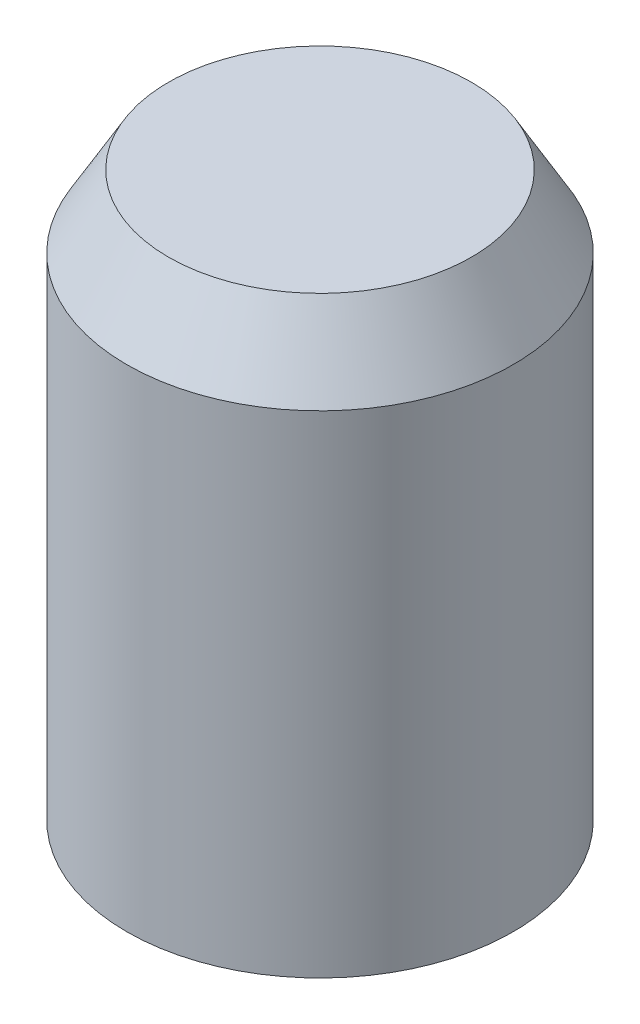
ISO-10303-21;
HEADER;
FILE_DESCRIPTION(('STEP AP214'),'2;1');
FILE_NAME('part.step','',(''),(''),'','','');
FILE_SCHEMA(('AUTOMOTIVE_DESIGN { 1 0 10303 214 1 1 1 1 }'));
ENDSEC;
DATA;
#1=APPLICATION_CONTEXT('core data for automotive mechanical design processes');
#2=APPLICATION_PROTOCOL_DEFINITION('international standard','automotive_design',2000,#1);
#3=PRODUCT_CONTEXT('',#1,'mechanical');
#4=PRODUCT('Part','Part','',(#3));
#5=PRODUCT_RELATED_PRODUCT_CATEGORY('part','',(#4));
#6=PRODUCT_DEFINITION_FORMATION('','',#4);
#7=PRODUCT_DEFINITION_CONTEXT('part definition',#1,'design');
#8=PRODUCT_DEFINITION('design','',#6,#7);
#9=PRODUCT_DEFINITION_SHAPE('','',#8);
#10=(LENGTH_UNIT() NAMED_UNIT(*) SI_UNIT(.MILLI.,.METRE.));
#11=(NAMED_UNIT(*) PLANE_ANGLE_UNIT() SI_UNIT($,.RADIAN.));
#12=(NAMED_UNIT(*) SI_UNIT($,.STERADIAN.) SOLID_ANGLE_UNIT());
#13=UNCERTAINTY_MEASURE_WITH_UNIT(LENGTH_MEASURE(1.E-05),#10,'distance_accuracy_value','');
#14=(GEOMETRIC_REPRESENTATION_CONTEXT(3) GLOBAL_UNCERTAINTY_ASSIGNED_CONTEXT((#13)) GLOBAL_UNIT_ASSIGNED_CONTEXT((#10,
#11,#12)) REPRESENTATION_CONTEXT('',''));
#15=CARTESIAN_POINT('',(0.,0.,0.));
#16=DIRECTION('',(0.,0.,1.));
#17=DIRECTION('',(1.,0.,0.));
#18=AXIS2_PLACEMENT_3D('',#15,#16,#17);
#19=CARTESIAN_POINT('',(0.,39.,0.));
#20=DIRECTION('',(0.,-1.,0.));
#21=DIRECTION('',(0.,0.,-1.));
#22=AXIS2_PLACEMENT_3D('',#19,#20,#21);
#23=CYLINDRICAL_SURFACE('',#22,13.375);
#24=CARTESIAN_POINT('',(0.,34.,0.));
#25=DIRECTION('',(0.,1.,0.));
#26=DIRECTION('',(0.,0.,1.));
#27=AXIS2_PLACEMENT_3D('',#24,#25,#26);
#28=CIRCLE('',#27,13.375);
#29=CARTESIAN_POINT('',(0.,34.,13.375));
#30=VERTEX_POINT('',#29);
#31=EDGE_CURVE('E10',#30,#30,#28,.F.);
#32=ORIENTED_EDGE('',*,*,#31,.T.);
#33=EDGE_LOOP('',(#32));
#34=FACE_BOUND('',#33,.T.);
#35=CARTESIAN_POINT('',(0.,0.,0.));
#36=DIRECTION('',(0.,1.,0.));
#37=DIRECTION('',(0.,0.,1.));
#38=AXIS2_PLACEMENT_3D('',#35,#36,#37);
#39=CIRCLE('',#38,13.375);
#40=CARTESIAN_POINT('',(0.,0.,13.375));
#41=VERTEX_POINT('',#40);
#42=EDGE_CURVE('E57',#41,#41,#39,.T.);
#43=ORIENTED_EDGE('',*,*,#42,.T.);
#44=EDGE_LOOP('',(#43));
#45=FACE_BOUND('',#44,.T.);
#46=ADVANCED_FACE('F43',(#34,#45),#23,.T.);
#47=CARTESIAN_POINT('',(0.,39.,0.));
#48=DIRECTION('',(0.,1.,0.));
#49=DIRECTION('',(0.,0.,1.));
#50=AXIS2_PLACEMENT_3D('',#47,#48,#49);
#51=PLANE('',#50);
#52=CARTESIAN_POINT('',(0.,39.,0.));
#53=DIRECTION('',(0.,1.,0.));
#54=DIRECTION('',(0.,0.,1.));
#55=AXIS2_PLACEMENT_3D('',#52,#53,#54);
#56=CIRCLE('',#55,10.4882486540519);
#57=CARTESIAN_POINT('',(0.,39.,10.4882486540519));
#58=VERTEX_POINT('',#57);
#59=EDGE_CURVE('E52',#58,#58,#56,.T.);
#60=ORIENTED_EDGE('',*,*,#59,.T.);
#61=EDGE_LOOP('',(#60));
#62=FACE_BOUND('',#61,.T.);
#63=ADVANCED_FACE('F68',(#62),#51,.T.);
#64=CARTESIAN_POINT('',(0.,0.,0.));
#65=DIRECTION('',(0.,1.,0.));
#66=DIRECTION('',(0.,0.,1.));
#67=AXIS2_PLACEMENT_3D('',#64,#65,#66);
#68=PLANE('',#67);
#69=ORIENTED_EDGE('',*,*,#42,.F.);
#70=EDGE_LOOP('',(#69));
#71=FACE_BOUND('',#70,.T.);
#72=ADVANCED_FACE('F66',(#71),#68,.F.);
#73=CARTESIAN_POINT('',(0.,39.,0.));
#74=DIRECTION('',(0.,-1.,0.));
#75=DIRECTION('',(0.,0.,-1.));
#76=AXIS2_PLACEMENT_3D('',#73,#74,#75);
#77=CONICAL_SURFACE('',#76,10.4882486540519,0.523598775598297);
#78=ORIENTED_EDGE('',*,*,#31,.F.);
#79=EDGE_LOOP('',(#78));
#80=FACE_BOUND('',#79,.T.);
#81=ORIENTED_EDGE('',*,*,#59,.F.);
#82=EDGE_LOOP('',(#81));
#83=FACE_BOUND('',#82,.T.);
#84=ADVANCED_FACE('F46',(#80,#83),#77,.T.);
#85=CLOSED_SHELL('',(#46,#63,#72,#84));
#86=MANIFOLD_SOLID_BREP('B2',#85);
#87=ADVANCED_BREP_SHAPE_REPRESENTATION('',(#18,#86),#14);
#88=SHAPE_DEFINITION_REPRESENTATION(#9,#87);
ENDSEC;
END-ISO-10303-21;
